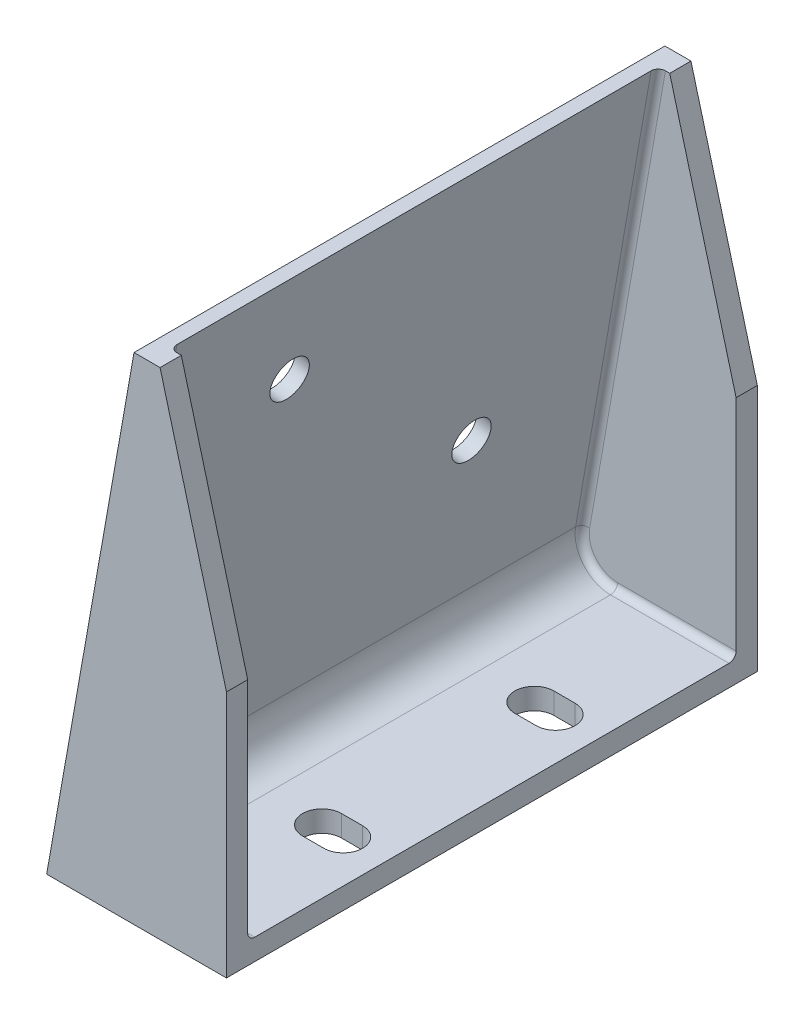
ISO-10303-21;
HEADER;
FILE_DESCRIPTION(('STEP AP214'),'2;1');
FILE_NAME('part.step','',(''),(''),'','','');
FILE_SCHEMA(('AUTOMOTIVE_DESIGN { 1 0 10303 214 1 1 1 1 }'));
ENDSEC;
DATA;
#1=APPLICATION_CONTEXT('core data for automotive mechanical design processes');
#2=APPLICATION_PROTOCOL_DEFINITION('international standard','automotive_design',2000,#1);
#3=PRODUCT_CONTEXT('',#1,'mechanical');
#4=PRODUCT('Part','Part','',(#3));
#5=PRODUCT_RELATED_PRODUCT_CATEGORY('part','',(#4));
#6=PRODUCT_DEFINITION_FORMATION('','',#4);
#7=PRODUCT_DEFINITION_CONTEXT('part definition',#1,'design');
#8=PRODUCT_DEFINITION('design','',#6,#7);
#9=PRODUCT_DEFINITION_SHAPE('','',#8);
#10=(LENGTH_UNIT() NAMED_UNIT(*) SI_UNIT(.MILLI.,.METRE.));
#11=(NAMED_UNIT(*) PLANE_ANGLE_UNIT() SI_UNIT($,.RADIAN.));
#12=(NAMED_UNIT(*) SI_UNIT($,.STERADIAN.) SOLID_ANGLE_UNIT());
#13=UNCERTAINTY_MEASURE_WITH_UNIT(LENGTH_MEASURE(1.E-05),#10,'distance_accuracy_value','');
#14=(GEOMETRIC_REPRESENTATION_CONTEXT(3) GLOBAL_UNCERTAINTY_ASSIGNED_CONTEXT((#13)) GLOBAL_UNIT_ASSIGNED_CONTEXT((#10,
#11,#12)) REPRESENTATION_CONTEXT('',''));
#15=CARTESIAN_POINT('',(0.,0.,0.));
#16=DIRECTION('',(0.,0.,1.));
#17=DIRECTION('',(1.,0.,0.));
#18=AXIS2_PLACEMENT_3D('',#15,#16,#17);
#19=CARTESIAN_POINT('',(-25.4,0.,37.5));
#20=DIRECTION('',(0.,1.,0.));
#21=DIRECTION('',(0.,0.,1.));
#22=AXIS2_PLACEMENT_3D('',#19,#20,#21);
#23=PLANE('',#22);
#24=DIRECTION('',(1.,0.,0.));
#25=VECTOR('',#24,1.);
#26=CARTESIAN_POINT('',(-8.99999999999999,0.,-17.75));
#27=LINE('',#26,#25);
#28=CARTESIAN_POINT('',(-8.99999999999999,0.,-17.75));
#29=VERTEX_POINT('',#28);
#30=CARTESIAN_POINT('',(-6.,0.,-17.75));
#31=VERTEX_POINT('',#30);
#32=EDGE_CURVE('E413',#29,#31,#27,.T.);
#33=ORIENTED_EDGE('',*,*,#32,.F.);
#34=CARTESIAN_POINT('',(-8.99999999999999,0.,-15.));
#35=DIRECTION('',(0.,1.,0.));
#36=DIRECTION('',(0.,0.,1.));
#37=AXIS2_PLACEMENT_3D('',#34,#35,#36);
#38=CIRCLE('',#37,2.75);
#39=CARTESIAN_POINT('',(-8.99999999999999,0.,-12.25));
#40=VERTEX_POINT('',#39);
#41=EDGE_CURVE('E423',#29,#40,#38,.T.);
#42=ORIENTED_EDGE('',*,*,#41,.T.);
#43=DIRECTION('',(1.,0.,0.));
#44=VECTOR('',#43,1.);
#45=CARTESIAN_POINT('',(-8.99999999999999,0.,-12.25));
#46=LINE('',#45,#44);
#47=CARTESIAN_POINT('',(-6.,0.,-12.25));
#48=VERTEX_POINT('',#47);
#49=EDGE_CURVE('E409',#40,#48,#46,.T.);
#50=ORIENTED_EDGE('',*,*,#49,.T.);
#51=CARTESIAN_POINT('',(-6.,0.,-15.));
#52=DIRECTION('',(0.,1.,0.));
#53=DIRECTION('',(0.,0.,1.));
#54=AXIS2_PLACEMENT_3D('',#51,#52,#53);
#55=CIRCLE('',#54,2.75);
#56=EDGE_CURVE('E438',#48,#31,#55,.T.);
#57=ORIENTED_EDGE('',*,*,#56,.T.);
#58=EDGE_LOOP('',(#33,#42,#50,#57));
#59=FACE_BOUND('',#58,.T.);
#60=DIRECTION('',(1.,0.,0.));
#61=VECTOR('',#60,1.);
#62=CARTESIAN_POINT('',(-25.4,0.,-37.5));
#63=LINE('',#62,#61);
#64=CARTESIAN_POINT('',(-25.4,0.,-37.5));
#65=VERTEX_POINT('',#64);
#66=CARTESIAN_POINT('',(0.,0.,-37.5));
#67=VERTEX_POINT('',#66);
#68=EDGE_CURVE('E466',#65,#67,#63,.T.);
#69=ORIENTED_EDGE('',*,*,#68,.T.);
#70=DIRECTION('',(0.,0.,-1.));
#71=VECTOR('',#70,1.);
#72=CARTESIAN_POINT('',(0.,0.,37.5));
#73=LINE('',#72,#71);
#74=CARTESIAN_POINT('',(0.,0.,37.5));
#75=VERTEX_POINT('',#74);
#76=EDGE_CURVE('E504',#75,#67,#73,.T.);
#77=ORIENTED_EDGE('',*,*,#76,.F.);
#78=DIRECTION('',(1.,0.,0.));
#79=VECTOR('',#78,1.);
#80=CARTESIAN_POINT('',(-25.4,0.,37.5));
#81=LINE('',#80,#79);
#82=CARTESIAN_POINT('',(-25.4,0.,37.5));
#83=VERTEX_POINT('',#82);
#84=EDGE_CURVE('E469',#83,#75,#81,.T.);
#85=ORIENTED_EDGE('',*,*,#84,.F.);
#86=DIRECTION('',(0.,0.,-1.));
#87=VECTOR('',#86,1.);
#88=CARTESIAN_POINT('',(-25.4,0.,37.5));
#89=LINE('',#88,#87);
#90=EDGE_CURVE('E484',#83,#65,#89,.T.);
#91=ORIENTED_EDGE('',*,*,#90,.T.);
#92=EDGE_LOOP('',(#69,#77,#85,#91));
#93=FACE_BOUND('',#92,.T.);
#94=DIRECTION('',(1.,0.,0.));
#95=VECTOR('',#94,1.);
#96=CARTESIAN_POINT('',(-8.99999999999999,0.,12.25));
#97=LINE('',#96,#95);
#98=CARTESIAN_POINT('',(-8.99999999999999,0.,12.25));
#99=VERTEX_POINT('',#98);
#100=CARTESIAN_POINT('',(-6.,0.,12.25));
#101=VERTEX_POINT('',#100);
#102=EDGE_CURVE('E358',#99,#101,#97,.T.);
#103=ORIENTED_EDGE('',*,*,#102,.F.);
#104=CARTESIAN_POINT('',(-8.99999999999999,0.,15.));
#105=DIRECTION('',(0.,1.,0.));
#106=DIRECTION('',(0.,0.,1.));
#107=AXIS2_PLACEMENT_3D('',#104,#105,#106);
#108=CIRCLE('',#107,2.75);
#109=CARTESIAN_POINT('',(-8.99999999999999,0.,17.75));
#110=VERTEX_POINT('',#109);
#111=EDGE_CURVE('E371',#99,#110,#108,.T.);
#112=ORIENTED_EDGE('',*,*,#111,.T.);
#113=DIRECTION('',(1.,0.,0.));
#114=VECTOR('',#113,1.);
#115=CARTESIAN_POINT('',(-8.99999999999999,0.,17.75));
#116=LINE('',#115,#114);
#117=CARTESIAN_POINT('',(-6.,0.,17.75));
#118=VERTEX_POINT('',#117);
#119=EDGE_CURVE('E382',#110,#118,#116,.T.);
#120=ORIENTED_EDGE('',*,*,#119,.T.);
#121=CARTESIAN_POINT('',(-6.,0.,15.));
#122=DIRECTION('',(0.,1.,0.));
#123=DIRECTION('',(0.,0.,1.));
#124=AXIS2_PLACEMENT_3D('',#121,#122,#123);
#125=CIRCLE('',#124,2.75);
#126=EDGE_CURVE('E380',#118,#101,#125,.T.);
#127=ORIENTED_EDGE('',*,*,#126,.T.);
#128=EDGE_LOOP('',(#103,#112,#120,#127));
#129=FACE_BOUND('',#128,.T.);
#130=ADVANCED_FACE('F197',(#59,#93,#129),#23,.F.);
#131=CARTESIAN_POINT('',(0.,3.,0.));
#132=DIRECTION('',(0.,-1.,0.));
#133=DIRECTION('',(0.,0.,-1.));
#134=AXIS2_PLACEMENT_3D('',#131,#132,#133);
#135=PLANE('',#134);
#136=DIRECTION('',(0.,0.,-1.));
#137=VECTOR('',#136,1.);
#138=CARTESIAN_POINT('',(-16.7493620884587,3.,0.));
#139=LINE('',#138,#137);
#140=CARTESIAN_POINT('',(-16.7493620884587,3.,-33.5));
#141=VERTEX_POINT('',#140);
#142=CARTESIAN_POINT('',(-16.7493620884587,3.,33.5));
#143=VERTEX_POINT('',#142);
#144=EDGE_CURVE('E539',#141,#143,#139,.F.);
#145=ORIENTED_EDGE('',*,*,#144,.T.);
#146=DIRECTION('',(1.,0.,0.));
#147=VECTOR('',#146,1.);
#148=CARTESIAN_POINT('',(0.,3.,33.5));
#149=LINE('',#148,#147);
#150=CARTESIAN_POINT('',(0.,3.,33.5));
#151=VERTEX_POINT('',#150);
#152=EDGE_CURVE('E547',#143,#151,#149,.T.);
#153=ORIENTED_EDGE('',*,*,#152,.T.);
#154=DIRECTION('',(0.,0.,-1.));
#155=VECTOR('',#154,1.);
#156=CARTESIAN_POINT('',(0.,3.,-34.5));
#157=LINE('',#156,#155);
#158=CARTESIAN_POINT('',(0.,3.,-33.5));
#159=VERTEX_POINT('',#158);
#160=EDGE_CURVE('E449',#151,#159,#157,.T.);
#161=ORIENTED_EDGE('',*,*,#160,.T.);
#162=DIRECTION('',(-1.,0.,0.));
#163=VECTOR('',#162,1.);
#164=CARTESIAN_POINT('',(-16.7493620884587,3.,-33.5));
#165=LINE('',#164,#163);
#166=EDGE_CURVE('E543',#159,#141,#165,.T.);
#167=ORIENTED_EDGE('',*,*,#166,.T.);
#168=EDGE_LOOP('',(#145,#153,#161,#167));
#169=FACE_BOUND('',#168,.T.);
#170=CARTESIAN_POINT('',(-8.99999999999999,3.,-15.));
#171=DIRECTION('',(0.,1.,0.));
#172=DIRECTION('',(0.,0.,1.));
#173=AXIS2_PLACEMENT_3D('',#170,#171,#172);
#174=CIRCLE('',#173,2.74999999999999);
#175=CARTESIAN_POINT('',(-8.99999999999999,3.,-17.75));
#176=VERTEX_POINT('',#175);
#177=CARTESIAN_POINT('',(-8.99999999999999,3.,-12.25));
#178=VERTEX_POINT('',#177);
#179=EDGE_CURVE('E420',#176,#178,#174,.T.);
#180=ORIENTED_EDGE('',*,*,#179,.F.);
#181=DIRECTION('',(1.,0.,0.));
#182=VECTOR('',#181,1.);
#183=CARTESIAN_POINT('',(-8.99999999999999,3.,-17.75));
#184=LINE('',#183,#182);
#185=CARTESIAN_POINT('',(-6.,3.,-17.75));
#186=VERTEX_POINT('',#185);
#187=EDGE_CURVE('E416',#176,#186,#184,.T.);
#188=ORIENTED_EDGE('',*,*,#187,.T.);
#189=CARTESIAN_POINT('',(-6.,3.,-15.));
#190=DIRECTION('',(0.,1.,0.));
#191=DIRECTION('',(0.,0.,1.));
#192=AXIS2_PLACEMENT_3D('',#189,#190,#191);
#193=CIRCLE('',#192,2.74999999999999);
#194=CARTESIAN_POINT('',(-6.,3.,-12.25));
#195=VERTEX_POINT('',#194);
#196=EDGE_CURVE('E434',#195,#186,#193,.T.);
#197=ORIENTED_EDGE('',*,*,#196,.F.);
#198=DIRECTION('',(1.,0.,0.));
#199=VECTOR('',#198,1.);
#200=CARTESIAN_POINT('',(-8.99999999999999,3.,-12.25));
#201=LINE('',#200,#199);
#202=EDGE_CURVE('E406',#178,#195,#201,.T.);
#203=ORIENTED_EDGE('',*,*,#202,.F.);
#204=EDGE_LOOP('',(#180,#188,#197,#203));
#205=FACE_BOUND('',#204,.T.);
#206=DIRECTION('',(1.,0.,0.));
#207=VECTOR('',#206,1.);
#208=CARTESIAN_POINT('',(-8.99999999999999,3.,17.75));
#209=LINE('',#208,#207);
#210=CARTESIAN_POINT('',(-8.99999999999999,3.,17.75));
#211=VERTEX_POINT('',#210);
#212=CARTESIAN_POINT('',(-6.,3.,17.75));
#213=VERTEX_POINT('',#212);
#214=EDGE_CURVE('E387',#211,#213,#209,.T.);
#215=ORIENTED_EDGE('',*,*,#214,.F.);
#216=CARTESIAN_POINT('',(-8.99999999999999,3.,15.));
#217=DIRECTION('',(0.,1.,0.));
#218=DIRECTION('',(0.,0.,1.));
#219=AXIS2_PLACEMENT_3D('',#216,#217,#218);
#220=CIRCLE('',#219,2.74999999999999);
#221=CARTESIAN_POINT('',(-8.99999999999999,3.,12.25));
#222=VERTEX_POINT('',#221);
#223=EDGE_CURVE('E376',#222,#211,#220,.T.);
#224=ORIENTED_EDGE('',*,*,#223,.F.);
#225=DIRECTION('',(1.,0.,0.));
#226=VECTOR('',#225,1.);
#227=CARTESIAN_POINT('',(-8.99999999999999,3.,12.25));
#228=LINE('',#227,#226);
#229=CARTESIAN_POINT('',(-6.,3.,12.25));
#230=VERTEX_POINT('',#229);
#231=EDGE_CURVE('E361',#222,#230,#228,.T.);
#232=ORIENTED_EDGE('',*,*,#231,.T.);
#233=CARTESIAN_POINT('',(-6.,3.,15.));
#234=DIRECTION('',(0.,1.,0.));
#235=DIRECTION('',(0.,0.,1.));
#236=AXIS2_PLACEMENT_3D('',#233,#234,#235);
#237=CIRCLE('',#236,2.74999999999999);
#238=EDGE_CURVE('E366',#213,#230,#237,.T.);
#239=ORIENTED_EDGE('',*,*,#238,.F.);
#240=EDGE_LOOP('',(#215,#224,#232,#239));
#241=FACE_BOUND('',#240,.T.);
#242=ADVANCED_FACE('F661',(#169,#205,#241),#135,.F.);
#243=CARTESIAN_POINT('',(0.,0.,37.5));
#244=DIRECTION('',(-1.,0.,0.));
#245=DIRECTION('',(0.,0.,1.));
#246=AXIS2_PLACEMENT_3D('',#243,#244,#245);
#247=PLANE('',#246);
#248=DIRECTION('',(0.,1.,0.));
#249=VECTOR('',#248,1.);
#250=CARTESIAN_POINT('',(0.,0.,-37.5));
#251=LINE('',#250,#249);
#252=CARTESIAN_POINT('',(0.,34.9999999999995,-37.5));
#253=VERTEX_POINT('',#252);
#254=EDGE_CURVE('E488',#67,#253,#251,.T.);
#255=ORIENTED_EDGE('',*,*,#254,.T.);
#256=DIRECTION('',(0.,0.,1.));
#257=VECTOR('',#256,1.);
#258=CARTESIAN_POINT('',(0.,34.9999999999995,37.5));
#259=LINE('',#258,#257);
#260=CARTESIAN_POINT('',(0.,34.9999999999995,-34.5));
#261=VERTEX_POINT('',#260);
#262=EDGE_CURVE('E522',#253,#261,#259,.T.);
#263=ORIENTED_EDGE('',*,*,#262,.T.);
#264=DIRECTION('',(0.,1.,0.));
#265=VECTOR('',#264,1.);
#266=CARTESIAN_POINT('',(0.,3.,-34.5));
#267=LINE('',#266,#265);
#268=CARTESIAN_POINT('',(0.,4.,-34.5));
#269=VERTEX_POINT('',#268);
#270=EDGE_CURVE('E453',#269,#261,#267,.T.);
#271=ORIENTED_EDGE('',*,*,#270,.F.);
#272=CARTESIAN_POINT('',(0.,4.,-33.5));
#273=DIRECTION('',(-1.,0.,0.));
#274=DIRECTION('',(0.,0.,1.));
#275=AXIS2_PLACEMENT_3D('',#272,#273,#274);
#276=CIRCLE('',#275,1.);
#277=EDGE_CURVE('E583',#269,#159,#276,.T.);
#278=ORIENTED_EDGE('',*,*,#277,.T.);
#279=ORIENTED_EDGE('',*,*,#160,.F.);
#280=CARTESIAN_POINT('',(0.,4.,33.5));
#281=DIRECTION('',(-1.,0.,0.));
#282=DIRECTION('',(0.,0.,1.));
#283=AXIS2_PLACEMENT_3D('',#280,#281,#282);
#284=CIRCLE('',#283,1.);
#285=CARTESIAN_POINT('',(0.,4.,34.5));
#286=VERTEX_POINT('',#285);
#287=EDGE_CURVE('E580',#151,#286,#284,.T.);
#288=ORIENTED_EDGE('',*,*,#287,.T.);
#289=DIRECTION('',(0.,1.,0.));
#290=VECTOR('',#289,1.);
#291=CARTESIAN_POINT('',(0.,3.,34.5));
#292=LINE('',#291,#290);
#293=CARTESIAN_POINT('',(0.,34.9999999999995,34.5));
#294=VERTEX_POINT('',#293);
#295=EDGE_CURVE('E463',#286,#294,#292,.T.);
#296=ORIENTED_EDGE('',*,*,#295,.T.);
#297=DIRECTION('',(0.,0.,1.));
#298=VECTOR('',#297,1.);
#299=CARTESIAN_POINT('',(0.,34.9999999999995,37.5));
#300=LINE('',#299,#298);
#301=CARTESIAN_POINT('',(0.,34.9999999999995,37.5));
#302=VERTEX_POINT('',#301);
#303=EDGE_CURVE('E519',#294,#302,#300,.T.);
#304=ORIENTED_EDGE('',*,*,#303,.T.);
#305=DIRECTION('',(0.,1.,0.));
#306=VECTOR('',#305,1.);
#307=CARTESIAN_POINT('',(0.,0.,37.5));
#308=LINE('',#307,#306);
#309=EDGE_CURVE('E473',#75,#302,#308,.T.);
#310=ORIENTED_EDGE('',*,*,#309,.F.);
#311=ORIENTED_EDGE('',*,*,#76,.T.);
#312=EDGE_LOOP('',(#255,#263,#271,#278,#279,#288,#296,#304,#310,#311));
#313=FACE_BOUND('',#312,.T.);
#314=ADVANCED_FACE('F671',(#313),#247,.F.);
#315=CARTESIAN_POINT('',(0.,70.,37.5));
#316=DIRECTION('',(0.,-1.,0.));
#317=DIRECTION('',(0.,0.,-1.));
#318=AXIS2_PLACEMENT_3D('',#315,#316,#317);
#319=PLANE('',#318);
#320=DIRECTION('',(-1.,0.,0.));
#321=VECTOR('',#320,1.);
#322=CARTESIAN_POINT('',(0.,70.,-34.5));
#323=LINE('',#322,#321);
#324=CARTESIAN_POINT('',(-9.37822173508932,70.,-34.5));
#325=VERTEX_POINT('',#324);
#326=CARTESIAN_POINT('',(-9.98487240510703,70.,-34.5));
#327=VERTEX_POINT('',#326);
#328=EDGE_CURVE('E448',#325,#327,#323,.T.);
#329=ORIENTED_EDGE('',*,*,#328,.F.);
#330=DIRECTION('',(0.,0.,-1.));
#331=VECTOR('',#330,1.);
#332=CARTESIAN_POINT('',(-9.37822173508932,70.,37.5));
#333=LINE('',#332,#331);
#334=CARTESIAN_POINT('',(-9.37822173508932,70.,-37.5));
#335=VERTEX_POINT('',#334);
#336=EDGE_CURVE('E512',#325,#335,#333,.T.);
#337=ORIENTED_EDGE('',*,*,#336,.T.);
#338=DIRECTION('',(-1.,0.,0.));
#339=VECTOR('',#338,1.);
#340=CARTESIAN_POINT('',(0.,70.,-37.5));
#341=LINE('',#340,#339);
#342=CARTESIAN_POINT('',(-13.0571113504072,70.,-37.5));
#343=VERTEX_POINT('',#342);
#344=EDGE_CURVE('E492',#335,#343,#341,.T.);
#345=ORIENTED_EDGE('',*,*,#344,.T.);
#346=DIRECTION('',(0.,0.,-1.));
#347=VECTOR('',#346,1.);
#348=CARTESIAN_POINT('',(-13.0571113504072,70.,37.5));
#349=LINE('',#348,#347);
#350=CARTESIAN_POINT('',(-13.0571113504072,70.,37.5));
#351=VERTEX_POINT('',#350);
#352=EDGE_CURVE('E500',#351,#343,#349,.T.);
#353=ORIENTED_EDGE('',*,*,#352,.F.);
#354=DIRECTION('',(-1.,0.,0.));
#355=VECTOR('',#354,1.);
#356=CARTESIAN_POINT('',(0.,70.,37.5));
#357=LINE('',#356,#355);
#358=CARTESIAN_POINT('',(-9.37822173508932,70.,37.5));
#359=VERTEX_POINT('',#358);
#360=EDGE_CURVE('E478',#359,#351,#357,.T.);
#361=ORIENTED_EDGE('',*,*,#360,.F.);
#362=DIRECTION('',(0.,0.,-1.));
#363=VECTOR('',#362,1.);
#364=CARTESIAN_POINT('',(-9.37822173508932,70.,37.5));
#365=LINE('',#364,#363);
#366=CARTESIAN_POINT('',(-9.37822173508932,70.,34.5));
#367=VERTEX_POINT('',#366);
#368=EDGE_CURVE('E508',#359,#367,#365,.T.);
#369=ORIENTED_EDGE('',*,*,#368,.T.);
#370=DIRECTION('',(1.,0.,0.));
#371=VECTOR('',#370,1.);
#372=CARTESIAN_POINT('',(0.,70.,34.5));
#373=LINE('',#372,#371);
#374=CARTESIAN_POINT('',(-9.98487240510702,70.,34.5));
#375=VERTEX_POINT('',#374);
#376=EDGE_CURVE('E454',#375,#367,#373,.T.);
#377=ORIENTED_EDGE('',*,*,#376,.F.);
#378=CARTESIAN_POINT('',(-9.98487240510703,70.,33.5));
#379=DIRECTION('',(0.,-1.,0.));
#380=DIRECTION('',(-1.,0.,0.));
#381=AXIS2_PLACEMENT_3D('',#378,#379,#380);
#382=ELLIPSE('',#381,1.01512759489297,1.);
#383=CARTESIAN_POINT('',(-11.,70.,33.5));
#384=VERTEX_POINT('',#383);
#385=EDGE_CURVE('E207',#375,#384,#382,.T.);
#386=ORIENTED_EDGE('',*,*,#385,.T.);
#387=DIRECTION('',(0.,0.,1.));
#388=VECTOR('',#387,1.);
#389=CARTESIAN_POINT('',(-11.,70.,-34.5));
#390=LINE('',#389,#388);
#391=CARTESIAN_POINT('',(-11.,70.,-33.5));
#392=VERTEX_POINT('',#391);
#393=EDGE_CURVE('E458',#392,#384,#390,.T.);
#394=ORIENTED_EDGE('',*,*,#393,.F.);
#395=CARTESIAN_POINT('',(-9.98487240510703,70.,-33.5));
#396=DIRECTION('',(0.,-1.,0.));
#397=DIRECTION('',(-1.,0.,0.));
#398=AXIS2_PLACEMENT_3D('',#395,#396,#397);
#399=ELLIPSE('',#398,1.01512759489297,1.);
#400=EDGE_CURVE('E13',#392,#327,#399,.T.);
#401=ORIENTED_EDGE('',*,*,#400,.T.);
#402=EDGE_LOOP('',(#329,#337,#345,#353,#361,#369,#377,#386,#394,#401));
#403=FACE_BOUND('',#402,.T.);
#404=ADVANCED_FACE('F613',(#403),#319,.F.);
#405=CARTESIAN_POINT('',(-13.0571113504072,70.,37.5));
#406=DIRECTION('',(0.984807753012207,-0.173648177666934,0.));
#407=DIRECTION('',(0.173648177666934,0.984807753012207,0.));
#408=AXIS2_PLACEMENT_3D('',#405,#406,#407);
#409=PLANE('',#408);
#410=CARTESIAN_POINT('',(-15.6003986722697,55.5763008494569,15.));
#411=DIRECTION('',(0.984807753012207,-0.173648177666934,0.));
#412=DIRECTION('',(0.173648177666934,0.984807753012207,0.));
#413=AXIS2_PLACEMENT_3D('',#410,#411,#412);
#414=ELLIPSE('',#413,2.75000387400915,2.74999999999999);
#415=CARTESIAN_POINT('',(-15.122865510971,58.2845259853948,15.));
#416=VERTEX_POINT('',#415);
#417=EDGE_CURVE('E946',#416,#416,#414,.T.);
#418=ORIENTED_EDGE('',*,*,#417,.T.);
#419=EDGE_LOOP('',(#418));
#420=FACE_BOUND('',#419,.T.);
#421=CARTESIAN_POINT('',(-19.9416092295306,30.9560723409313,-15.));
#422=DIRECTION('',(0.984807753012207,-0.173648177666934,0.));
#423=DIRECTION('',(0.173648177666934,0.984807753012207,0.));
#424=AXIS2_PLACEMENT_3D('',#421,#422,#423);
#425=ELLIPSE('',#424,2.75000387400915,2.74999999999999);
#426=CARTESIAN_POINT('',(-19.4640760682319,33.6642974768691,-15.));
#427=VERTEX_POINT('',#426);
#428=EDGE_CURVE('E949',#427,#427,#425,.T.);
#429=ORIENTED_EDGE('',*,*,#428,.T.);
#430=EDGE_LOOP('',(#429));
#431=FACE_BOUND('',#430,.T.);
#432=DIRECTION('',(-0.173648177666934,-0.984807753012208,0.));
#433=VECTOR('',#432,1.);
#434=CARTESIAN_POINT('',(-13.0571113504072,70.,-37.5));
#435=LINE('',#434,#433);
#436=EDGE_CURVE('E474',#343,#65,#435,.T.);
#437=ORIENTED_EDGE('',*,*,#436,.T.);
#438=ORIENTED_EDGE('',*,*,#90,.F.);
#439=DIRECTION('',(-0.173648177666934,-0.984807753012208,0.));
#440=VECTOR('',#439,1.);
#441=CARTESIAN_POINT('',(-13.0571113504072,70.,37.5));
#442=LINE('',#441,#440);
#443=EDGE_CURVE('E481',#351,#83,#442,.T.);
#444=ORIENTED_EDGE('',*,*,#443,.F.);
#445=ORIENTED_EDGE('',*,*,#352,.T.);
#446=EDGE_LOOP('',(#437,#438,#444,#445));
#447=FACE_BOUND('',#446,.T.);
#448=ADVANCED_FACE('F630',(#420,#431,#447),#409,.F.);
#449=CARTESIAN_POINT('',(0.,0.,37.5));
#450=DIRECTION('',(0.,0.,1.));
#451=DIRECTION('',(1.,0.,0.));
#452=AXIS2_PLACEMENT_3D('',#449,#450,#451);
#453=PLANE('',#452);
#454=ORIENTED_EDGE('',*,*,#309,.T.);
#455=DIRECTION('',(0.258819045102518,-0.965925826289069,0.));
#456=VECTOR('',#455,1.);
#457=CARTESIAN_POINT('',(8.74999999999979,2.34455543377224,37.5));
#458=LINE('',#457,#456);
#459=EDGE_CURVE('E533',#302,#359,#458,.F.);
#460=ORIENTED_EDGE('',*,*,#459,.T.);
#461=ORIENTED_EDGE('',*,*,#360,.T.);
#462=ORIENTED_EDGE('',*,*,#443,.T.);
#463=ORIENTED_EDGE('',*,*,#84,.T.);
#464=EDGE_LOOP('',(#454,#460,#461,#462,#463));
#465=FACE_BOUND('',#464,.T.);
#466=ADVANCED_FACE('F636',(#465),#453,.T.);
#467=CARTESIAN_POINT('',(0.,0.,-37.5));
#468=DIRECTION('',(0.,0.,1.));
#469=DIRECTION('',(1.,0.,0.));
#470=AXIS2_PLACEMENT_3D('',#467,#468,#469);
#471=PLANE('',#470);
#472=ORIENTED_EDGE('',*,*,#344,.F.);
#473=DIRECTION('',(-0.258819045102518,0.965925826289069,0.));
#474=VECTOR('',#473,1.);
#475=CARTESIAN_POINT('',(-9.37822173508932,70.,-37.5));
#476=LINE('',#475,#474);
#477=EDGE_CURVE('E516',#335,#253,#476,.F.);
#478=ORIENTED_EDGE('',*,*,#477,.T.);
#479=ORIENTED_EDGE('',*,*,#254,.F.);
#480=ORIENTED_EDGE('',*,*,#68,.F.);
#481=ORIENTED_EDGE('',*,*,#436,.F.);
#482=EDGE_LOOP('',(#472,#478,#479,#480,#481));
#483=FACE_BOUND('',#482,.T.);
#484=ADVANCED_FACE('F626',(#483),#471,.F.);
#485=CARTESIAN_POINT('',(0.,3.,34.5));
#486=DIRECTION('',(0.,0.,1.));
#487=DIRECTION('',(1.,0.,0.));
#488=AXIS2_PLACEMENT_3D('',#485,#486,#487);
#489=PLANE('',#488);
#490=ORIENTED_EDGE('',*,*,#295,.F.);
#491=DIRECTION('',(1.,0.,0.));
#492=VECTOR('',#491,1.);
#493=CARTESIAN_POINT('',(-16.7493620884587,4.,34.5));
#494=LINE('',#493,#492);
#495=CARTESIAN_POINT('',(-16.7493620884587,4.00000000000001,34.5));
#496=VERTEX_POINT('',#495);
#497=EDGE_CURVE('E557',#286,#496,#494,.F.);
#498=ORIENTED_EDGE('',*,*,#497,.T.);
#499=CARTESIAN_POINT('',(-16.7493620884587,8.00000000000001,34.5));
#500=DIRECTION('',(0.,0.,1.));
#501=DIRECTION('',(1.,0.,0.));
#502=AXIS2_PLACEMENT_3D('',#499,#500,#501);
#503=CIRCLE('',#502,4.);
#504=CARTESIAN_POINT('',(-20.6897534443077,8.68797962379047,34.5));
#505=VERTEX_POINT('',#504);
#506=EDGE_CURVE('E554',#496,#505,#503,.F.);
#507=ORIENTED_EDGE('',*,*,#506,.T.);
#508=DIRECTION('',(-0.171994905947615,-0.985097838962238,0.));
#509=VECTOR('',#508,1.);
#510=CARTESIAN_POINT('',(-21.0414287174676,6.67376559984821,34.5));
#511=LINE('',#510,#509);
#512=EDGE_CURVE('E551',#505,#375,#511,.F.);
#513=ORIENTED_EDGE('',*,*,#512,.T.);
#514=ORIENTED_EDGE('',*,*,#376,.T.);
#515=DIRECTION('',(-0.258819045102518,0.965925826289069,0.));
#516=VECTOR('',#515,1.);
#517=CARTESIAN_POINT('',(-9.37822173508932,70.,34.5));
#518=LINE('',#517,#516);
#519=EDGE_CURVE('E529',#367,#294,#518,.F.);
#520=ORIENTED_EDGE('',*,*,#519,.T.);
#521=EDGE_LOOP('',(#490,#498,#507,#513,#514,#520));
#522=FACE_BOUND('',#521,.T.);
#523=ADVANCED_FACE('F646',(#522),#489,.F.);
#524=CARTESIAN_POINT('',(0.,3.,-34.5));
#525=DIRECTION('',(0.,0.,-1.));
#526=DIRECTION('',(-1.,0.,0.));
#527=AXIS2_PLACEMENT_3D('',#524,#525,#526);
#528=PLANE('',#527);
#529=CARTESIAN_POINT('',(-16.7493620884587,8.00000000000001,-34.5));
#530=DIRECTION('',(0.,0.,-1.));
#531=DIRECTION('',(-1.,0.,0.));
#532=AXIS2_PLACEMENT_3D('',#529,#530,#531);
#533=CIRCLE('',#532,4.);
#534=CARTESIAN_POINT('',(-20.6897534443077,8.68797962379047,-34.5));
#535=VERTEX_POINT('',#534);
#536=CARTESIAN_POINT('',(-16.7493620884587,4.00000000000001,-34.5));
#537=VERTEX_POINT('',#536);
#538=EDGE_CURVE('E569',#535,#537,#533,.F.);
#539=ORIENTED_EDGE('',*,*,#538,.T.);
#540=DIRECTION('',(-1.,0.,0.));
#541=VECTOR('',#540,1.);
#542=CARTESIAN_POINT('',(0.,4.,-34.5));
#543=LINE('',#542,#541);
#544=EDGE_CURVE('E572',#537,#269,#543,.F.);
#545=ORIENTED_EDGE('',*,*,#544,.T.);
#546=ORIENTED_EDGE('',*,*,#270,.T.);
#547=DIRECTION('',(0.258819045102518,-0.965925826289069,0.));
#548=VECTOR('',#547,1.);
#549=CARTESIAN_POINT('',(-9.37822173508932,70.,-34.5));
#550=LINE('',#549,#548);
#551=EDGE_CURVE('E526',#261,#325,#550,.F.);
#552=ORIENTED_EDGE('',*,*,#551,.T.);
#553=ORIENTED_EDGE('',*,*,#328,.T.);
#554=DIRECTION('',(-0.171994905947615,-0.985097838962238,0.));
#555=VECTOR('',#554,1.);
#556=CARTESIAN_POINT('',(-21.0414287174676,6.67376559984821,-34.5));
#557=LINE('',#556,#555);
#558=EDGE_CURVE('E566',#327,#535,#557,.T.);
#559=ORIENTED_EDGE('',*,*,#558,.T.);
#560=EDGE_LOOP('',(#539,#545,#546,#552,#553,#559));
#561=FACE_BOUND('',#560,.T.);
#562=ADVANCED_FACE('F616',(#561),#528,.F.);
#563=CARTESIAN_POINT('',(-11.,70.,102.513548857829));
#564=DIRECTION('',(0.985097838962238,-0.171994905947614,0.));
#565=DIRECTION('',(0.171994905947615,0.985097838962238,0.));
#566=AXIS2_PLACEMENT_3D('',#563,#564,#565);
#567=PLANE('',#566);
#568=CARTESIAN_POINT('',(-13.5799235892142,55.2235324155664,15.));
#569=DIRECTION('',(0.985097838962238,-0.171994905947614,0.));
#570=DIRECTION('',(0.171994905947615,0.985097838962238,0.));
#571=AXIS2_PLACEMENT_3D('',#568,#569,#570);
#572=CIRCLE('',#571,2.74999999999999);
#573=CARTESIAN_POINT('',(-13.1069375978583,57.9325514727126,15.));
#574=VERTEX_POINT('',#573);
#575=EDGE_CURVE('E595',#574,#574,#572,.T.);
#576=ORIENTED_EDGE('',*,*,#575,.F.);
#577=EDGE_LOOP('',(#576));
#578=FACE_BOUND('',#577,.T.);
#579=CARTESIAN_POINT('',(-17.8797962379046,30.5960864415105,-15.));
#580=DIRECTION('',(0.985097838962238,-0.171994905947614,0.));
#581=DIRECTION('',(0.171994905947615,0.985097838962238,0.));
#582=AXIS2_PLACEMENT_3D('',#579,#580,#581);
#583=CIRCLE('',#582,2.74999999999999);
#584=CARTESIAN_POINT('',(-17.4068102465487,33.3051054986566,-15.));
#585=VERTEX_POINT('',#584);
#586=EDGE_CURVE('E952',#585,#585,#583,.T.);
#587=ORIENTED_EDGE('',*,*,#586,.F.);
#588=EDGE_LOOP('',(#587));
#589=FACE_BOUND('',#588,.T.);
#590=ORIENTED_EDGE('',*,*,#393,.T.);
#591=DIRECTION('',(-0.171994905947615,-0.985097838962238,0.));
#592=VECTOR('',#591,1.);
#593=CARTESIAN_POINT('',(-11.,70.,33.5));
#594=LINE('',#593,#592);
#595=CARTESIAN_POINT('',(-21.6748512832699,8.85997452973809,33.5));
#596=VERTEX_POINT('',#595);
#597=EDGE_CURVE('E577',#384,#596,#594,.T.);
#598=ORIENTED_EDGE('',*,*,#597,.T.);
#599=DIRECTION('',(0.,0.,-1.));
#600=VECTOR('',#599,1.);
#601=CARTESIAN_POINT('',(-21.6748512832699,8.85997452973809,102.513548857829));
#602=LINE('',#601,#600);
#603=CARTESIAN_POINT('',(-21.6748512832699,8.85997452973809,-33.5));
#604=VERTEX_POINT('',#603);
#605=EDGE_CURVE('E536',#596,#604,#602,.T.);
#606=ORIENTED_EDGE('',*,*,#605,.T.);
#607=DIRECTION('',(-0.171994905947615,-0.985097838962238,0.));
#608=VECTOR('',#607,1.);
#609=CARTESIAN_POINT('',(-11.,70.,-33.5));
#610=LINE('',#609,#608);
#611=EDGE_CURVE('E221',#604,#392,#610,.F.);
#612=ORIENTED_EDGE('',*,*,#611,.T.);
#613=EDGE_LOOP('',(#590,#598,#606,#612));
#614=FACE_BOUND('',#613,.T.);
#615=ADVANCED_FACE('F655',(#578,#589,#614),#567,.T.);
#616=CARTESIAN_POINT('',(-6.,3.,-15.));
#617=DIRECTION('',(0.,1.,0.));
#618=DIRECTION('',(0.,0.,1.));
#619=AXIS2_PLACEMENT_3D('',#616,#617,#618);
#620=CYLINDRICAL_SURFACE('',#619,2.74999999999999);
#621=ORIENTED_EDGE('',*,*,#56,.F.);
#622=DIRECTION('',(0.,1.,0.));
#623=VECTOR('',#622,1.);
#624=CARTESIAN_POINT('',(-6.,3.,-12.25));
#625=LINE('',#624,#623);
#626=EDGE_CURVE('E445',#195,#48,#625,.F.);
#627=ORIENTED_EDGE('',*,*,#626,.F.);
#628=ORIENTED_EDGE('',*,*,#196,.T.);
#629=DIRECTION('',(0.,1.,0.));
#630=VECTOR('',#629,1.);
#631=CARTESIAN_POINT('',(-6.,3.,-17.75));
#632=LINE('',#631,#630);
#633=EDGE_CURVE('E442',#31,#186,#632,.T.);
#634=ORIENTED_EDGE('',*,*,#633,.F.);
#635=EDGE_LOOP('',(#621,#627,#628,#634));
#636=FACE_BOUND('',#635,.T.);
#637=ADVANCED_FACE('F834',(#636),#620,.F.);
#638=CARTESIAN_POINT('',(-8.99999999999999,3.,-15.));
#639=DIRECTION('',(0.,1.,0.));
#640=DIRECTION('',(0.,0.,1.));
#641=AXIS2_PLACEMENT_3D('',#638,#639,#640);
#642=CYLINDRICAL_SURFACE('',#641,2.74999999999999);
#643=ORIENTED_EDGE('',*,*,#179,.T.);
#644=DIRECTION('',(0.,1.,0.));
#645=VECTOR('',#644,1.);
#646=CARTESIAN_POINT('',(-8.99999999999999,3.,-12.25));
#647=LINE('',#646,#645);
#648=EDGE_CURVE('E427',#40,#178,#647,.T.);
#649=ORIENTED_EDGE('',*,*,#648,.F.);
#650=ORIENTED_EDGE('',*,*,#41,.F.);
#651=DIRECTION('',(0.,1.,0.));
#652=VECTOR('',#651,1.);
#653=CARTESIAN_POINT('',(-8.99999999999999,3.,-17.75));
#654=LINE('',#653,#652);
#655=EDGE_CURVE('E431',#176,#29,#654,.F.);
#656=ORIENTED_EDGE('',*,*,#655,.F.);
#657=EDGE_LOOP('',(#643,#649,#650,#656));
#658=FACE_BOUND('',#657,.T.);
#659=ADVANCED_FACE('F825',(#658),#642,.F.);
#660=CARTESIAN_POINT('',(-8.99999999999999,3.,-17.75));
#661=DIRECTION('',(0.,0.,-1.));
#662=DIRECTION('',(-1.,0.,0.));
#663=AXIS2_PLACEMENT_3D('',#660,#661,#662);
#664=PLANE('',#663);
#665=ORIENTED_EDGE('',*,*,#633,.T.);
#666=ORIENTED_EDGE('',*,*,#187,.F.);
#667=ORIENTED_EDGE('',*,*,#655,.T.);
#668=ORIENTED_EDGE('',*,*,#32,.T.);
#669=EDGE_LOOP('',(#665,#666,#667,#668));
#670=FACE_BOUND('',#669,.T.);
#671=ADVANCED_FACE('F816',(#670),#664,.F.);
#672=CARTESIAN_POINT('',(-8.99999999999999,3.,-12.25));
#673=DIRECTION('',(0.,0.,1.));
#674=DIRECTION('',(1.,0.,0.));
#675=AXIS2_PLACEMENT_3D('',#672,#673,#674);
#676=PLANE('',#675);
#677=ORIENTED_EDGE('',*,*,#626,.T.);
#678=ORIENTED_EDGE('',*,*,#49,.F.);
#679=ORIENTED_EDGE('',*,*,#648,.T.);
#680=ORIENTED_EDGE('',*,*,#202,.T.);
#681=EDGE_LOOP('',(#677,#678,#679,#680));
#682=FACE_BOUND('',#681,.T.);
#683=ADVANCED_FACE('F807',(#682),#676,.F.);
#684=CARTESIAN_POINT('',(-6.,3.,15.));
#685=DIRECTION('',(0.,1.,0.));
#686=DIRECTION('',(0.,0.,1.));
#687=AXIS2_PLACEMENT_3D('',#684,#685,#686);
#688=CYLINDRICAL_SURFACE('',#687,2.74999999999999);
#689=ORIENTED_EDGE('',*,*,#126,.F.);
#690=DIRECTION('',(0.,1.,0.));
#691=VECTOR('',#690,1.);
#692=CARTESIAN_POINT('',(-6.,3.,17.75));
#693=LINE('',#692,#691);
#694=EDGE_CURVE('E403',#213,#118,#693,.F.);
#695=ORIENTED_EDGE('',*,*,#694,.F.);
#696=ORIENTED_EDGE('',*,*,#238,.T.);
#697=DIRECTION('',(0.,1.,0.));
#698=VECTOR('',#697,1.);
#699=CARTESIAN_POINT('',(-6.,3.,12.25));
#700=LINE('',#699,#698);
#701=EDGE_CURVE('E400',#101,#230,#700,.T.);
#702=ORIENTED_EDGE('',*,*,#701,.F.);
#703=EDGE_LOOP('',(#689,#695,#696,#702));
#704=FACE_BOUND('',#703,.T.);
#705=ADVANCED_FACE('F799',(#704),#688,.F.);
#706=CARTESIAN_POINT('',(-8.99999999999999,3.,15.));
#707=DIRECTION('',(0.,1.,0.));
#708=DIRECTION('',(0.,0.,1.));
#709=AXIS2_PLACEMENT_3D('',#706,#707,#708);
#710=CYLINDRICAL_SURFACE('',#709,2.74999999999999);
#711=ORIENTED_EDGE('',*,*,#223,.T.);
#712=DIRECTION('',(0.,1.,0.));
#713=VECTOR('',#712,1.);
#714=CARTESIAN_POINT('',(-8.99999999999999,3.,17.75));
#715=LINE('',#714,#713);
#716=EDGE_CURVE('E367',#110,#211,#715,.T.);
#717=ORIENTED_EDGE('',*,*,#716,.F.);
#718=ORIENTED_EDGE('',*,*,#111,.F.);
#719=DIRECTION('',(0.,1.,0.));
#720=VECTOR('',#719,1.);
#721=CARTESIAN_POINT('',(-8.99999999999999,3.,12.25));
#722=LINE('',#721,#720);
#723=EDGE_CURVE('E354',#222,#99,#722,.F.);
#724=ORIENTED_EDGE('',*,*,#723,.F.);
#725=EDGE_LOOP('',(#711,#717,#718,#724));
#726=FACE_BOUND('',#725,.T.);
#727=ADVANCED_FACE('F372',(#726),#710,.F.);
#728=CARTESIAN_POINT('',(-8.99999999999999,3.,12.25));
#729=DIRECTION('',(0.,0.,-1.));
#730=DIRECTION('',(-1.,0.,0.));
#731=AXIS2_PLACEMENT_3D('',#728,#729,#730);
#732=PLANE('',#731);
#733=ORIENTED_EDGE('',*,*,#701,.T.);
#734=ORIENTED_EDGE('',*,*,#231,.F.);
#735=ORIENTED_EDGE('',*,*,#723,.T.);
#736=ORIENTED_EDGE('',*,*,#102,.T.);
#737=EDGE_LOOP('',(#733,#734,#735,#736));
#738=FACE_BOUND('',#737,.T.);
#739=ADVANCED_FACE('F356',(#738),#732,.F.);
#740=CARTESIAN_POINT('',(-8.99999999999999,3.,17.75));
#741=DIRECTION('',(0.,0.,1.));
#742=DIRECTION('',(1.,0.,0.));
#743=AXIS2_PLACEMENT_3D('',#740,#741,#742);
#744=PLANE('',#743);
#745=ORIENTED_EDGE('',*,*,#694,.T.);
#746=ORIENTED_EDGE('',*,*,#119,.F.);
#747=ORIENTED_EDGE('',*,*,#716,.T.);
#748=ORIENTED_EDGE('',*,*,#214,.T.);
#749=EDGE_LOOP('',(#745,#746,#747,#748));
#750=FACE_BOUND('',#749,.T.);
#751=ADVANCED_FACE('F775',(#750),#744,.F.);
#752=CARTESIAN_POINT('',(-17.8797962379046,30.5960864415105,-15.));
#753=DIRECTION('',(0.985097838962238,-0.171994905947614,0.));
#754=DIRECTION('',(0.171994905947615,0.985097838962238,0.));
#755=AXIS2_PLACEMENT_3D('',#752,#753,#754);
#756=CYLINDRICAL_SURFACE('',#755,2.74999999999999);
#757=ORIENTED_EDGE('',*,*,#586,.T.);
#758=EDGE_LOOP('',(#757));
#759=FACE_BOUND('',#758,.T.);
#760=ORIENTED_EDGE('',*,*,#428,.F.);
#761=EDGE_LOOP('',(#760));
#762=FACE_BOUND('',#761,.T.);
#763=ADVANCED_FACE('F766',(#759,#762),#756,.F.);
#764=CARTESIAN_POINT('',(-13.5799235892142,55.2235324155664,15.));
#765=DIRECTION('',(0.985097838962238,-0.171994905947614,0.));
#766=DIRECTION('',(0.171994905947615,0.985097838962238,0.));
#767=AXIS2_PLACEMENT_3D('',#764,#765,#766);
#768=CYLINDRICAL_SURFACE('',#767,2.74999999999999);
#769=ORIENTED_EDGE('',*,*,#575,.T.);
#770=EDGE_LOOP('',(#769));
#771=FACE_BOUND('',#770,.T.);
#772=ORIENTED_EDGE('',*,*,#417,.F.);
#773=EDGE_LOOP('',(#772));
#774=FACE_BOUND('',#773,.T.);
#775=ADVANCED_FACE('F698',(#771,#774),#768,.F.);
#776=CARTESIAN_POINT('',(-9.37822173508932,70.,37.5));
#777=DIRECTION('',(-0.965925826289069,-0.258819045102518,0.));
#778=DIRECTION('',(0.,0.,-1.));
#779=AXIS2_PLACEMENT_3D('',#776,#777,#778);
#780=PLANE('',#779);
#781=ORIENTED_EDGE('',*,*,#551,.F.);
#782=ORIENTED_EDGE('',*,*,#262,.F.);
#783=ORIENTED_EDGE('',*,*,#477,.F.);
#784=ORIENTED_EDGE('',*,*,#336,.F.);
#785=EDGE_LOOP('',(#781,#782,#783,#784));
#786=FACE_BOUND('',#785,.T.);
#787=ADVANCED_FACE('F621',(#786),#780,.F.);
#788=CARTESIAN_POINT('',(-9.37822173508932,70.,37.5));
#789=DIRECTION('',(-0.965925826289069,-0.258819045102518,0.));
#790=DIRECTION('',(0.,0.,-1.));
#791=AXIS2_PLACEMENT_3D('',#788,#789,#790);
#792=PLANE('',#791);
#793=ORIENTED_EDGE('',*,*,#459,.F.);
#794=ORIENTED_EDGE('',*,*,#303,.F.);
#795=ORIENTED_EDGE('',*,*,#519,.F.);
#796=ORIENTED_EDGE('',*,*,#368,.F.);
#797=EDGE_LOOP('',(#793,#794,#795,#796));
#798=FACE_BOUND('',#797,.T.);
#799=ADVANCED_FACE('F642',(#798),#792,.F.);
#800=CARTESIAN_POINT('',(-16.7493620884587,8.00000000000001,102.513548857829));
#801=DIRECTION('',(0.,0.,-1.));
#802=DIRECTION('',(-1.,0.,0.));
#803=AXIS2_PLACEMENT_3D('',#800,#801,#802);
#804=CYLINDRICAL_SURFACE('',#803,5.);
#805=ORIENTED_EDGE('',*,*,#605,.F.);
#806=CARTESIAN_POINT('',(-16.7493620884587,8.00000000000001,33.5));
#807=DIRECTION('',(0.,0.,1.));
#808=DIRECTION('',(1.,0.,0.));
#809=AXIS2_PLACEMENT_3D('',#806,#807,#808);
#810=CIRCLE('',#809,5.);
#811=EDGE_CURVE('E563',#596,#143,#810,.T.);
#812=ORIENTED_EDGE('',*,*,#811,.T.);
#813=ORIENTED_EDGE('',*,*,#144,.F.);
#814=CARTESIAN_POINT('',(-16.7493620884587,8.00000000000001,-33.5));
#815=DIRECTION('',(0.,0.,-1.));
#816=DIRECTION('',(-1.,0.,0.));
#817=AXIS2_PLACEMENT_3D('',#814,#815,#816);
#818=CIRCLE('',#817,5.);
#819=EDGE_CURVE('E560',#141,#604,#818,.T.);
#820=ORIENTED_EDGE('',*,*,#819,.T.);
#821=EDGE_LOOP('',(#805,#812,#813,#820));
#822=FACE_BOUND('',#821,.T.);
#823=ADVANCED_FACE('F657',(#822),#804,.F.);
#824=CARTESIAN_POINT('',(-10.0149021610378,69.8280050940524,33.5));
#825=DIRECTION('',(-0.171994905947615,-0.985097838962238,0.));
#826=DIRECTION('',(0.985097838962238,-0.171994905947614,0.));
#827=AXIS2_PLACEMENT_3D('',#824,#825,#826);
#828=CYLINDRICAL_SURFACE('',#827,1.);
#829=ORIENTED_EDGE('',*,*,#385,.F.);
#830=ORIENTED_EDGE('',*,*,#512,.F.);
#831=CARTESIAN_POINT('',(-20.6897534443077,8.68797962379047,33.5));
#832=DIRECTION('',(0.171994905947614,0.985097838962238,0.));
#833=DIRECTION('',(-0.985097838962238,0.171994905947614,0.));
#834=AXIS2_PLACEMENT_3D('',#831,#832,#833);
#835=CIRCLE('',#834,1.);
#836=EDGE_CURVE('E592',#596,#505,#835,.T.);
#837=ORIENTED_EDGE('',*,*,#836,.F.);
#838=ORIENTED_EDGE('',*,*,#597,.F.);
#839=EDGE_LOOP('',(#829,#830,#837,#838));
#840=FACE_BOUND('',#839,.T.);
#841=ADVANCED_FACE('F651',(#840),#828,.F.);
#842=CARTESIAN_POINT('',(-16.7493620884587,8.00000000000001,33.5));
#843=DIRECTION('',(0.,0.,1.));
#844=DIRECTION('',(1.,0.,0.));
#845=AXIS2_PLACEMENT_3D('',#842,#843,#844);
#846=TOROIDAL_SURFACE('',#845,4.,1.);
#847=ORIENTED_EDGE('',*,*,#836,.T.);
#848=ORIENTED_EDGE('',*,*,#506,.F.);
#849=CARTESIAN_POINT('',(-16.7493620884587,4.00000000000001,33.5));
#850=DIRECTION('',(-1.,0.,0.));
#851=DIRECTION('',(0.,0.,1.));
#852=AXIS2_PLACEMENT_3D('',#849,#850,#851);
#853=CIRCLE('',#852,1.);
#854=EDGE_CURVE('E588',#143,#496,#853,.T.);
#855=ORIENTED_EDGE('',*,*,#854,.F.);
#856=ORIENTED_EDGE('',*,*,#811,.F.);
#857=EDGE_LOOP('',(#847,#848,#855,#856));
#858=FACE_BOUND('',#857,.T.);
#859=ADVANCED_FACE('F667',(#858),#846,.F.);
#860=CARTESIAN_POINT('',(0.,4.,33.5));
#861=DIRECTION('',(-1.,0.,0.));
#862=DIRECTION('',(0.,0.,1.));
#863=AXIS2_PLACEMENT_3D('',#860,#861,#862);
#864=CYLINDRICAL_SURFACE('',#863,1.);
#865=ORIENTED_EDGE('',*,*,#854,.T.);
#866=ORIENTED_EDGE('',*,*,#497,.F.);
#867=ORIENTED_EDGE('',*,*,#287,.F.);
#868=ORIENTED_EDGE('',*,*,#152,.F.);
#869=EDGE_LOOP('',(#865,#866,#867,#868));
#870=FACE_BOUND('',#869,.T.);
#871=ADVANCED_FACE('F669',(#870),#864,.F.);
#872=CARTESIAN_POINT('',(-21.0414287174676,6.67376559984821,-33.5));
#873=DIRECTION('',(-0.171994905947615,-0.985097838962238,0.));
#874=DIRECTION('',(0.985097838962238,-0.171994905947614,0.));
#875=AXIS2_PLACEMENT_3D('',#872,#873,#874);
#876=CYLINDRICAL_SURFACE('',#875,1.);
#877=ORIENTED_EDGE('',*,*,#400,.F.);
#878=ORIENTED_EDGE('',*,*,#611,.F.);
#879=CARTESIAN_POINT('',(-20.6897534443077,8.68797962379047,-33.5));
#880=DIRECTION('',(0.171994905947617,0.985097838962237,0.));
#881=DIRECTION('',(-0.985097838962237,0.171994905947617,0.));
#882=AXIS2_PLACEMENT_3D('',#879,#880,#881);
#883=CIRCLE('',#882,1.);
#884=EDGE_CURVE('E201',#535,#604,#883,.T.);
#885=ORIENTED_EDGE('',*,*,#884,.F.);
#886=ORIENTED_EDGE('',*,*,#558,.F.);
#887=EDGE_LOOP('',(#877,#878,#885,#886));
#888=FACE_BOUND('',#887,.T.);
#889=ADVANCED_FACE('F199',(#888),#876,.F.);
#890=CARTESIAN_POINT('',(-16.7493620884587,8.00000000000001,-33.5));
#891=DIRECTION('',(0.,0.,-1.));
#892=DIRECTION('',(-1.,0.,0.));
#893=AXIS2_PLACEMENT_3D('',#890,#891,#892);
#894=TOROIDAL_SURFACE('',#893,4.,1.);
#895=ORIENTED_EDGE('',*,*,#884,.T.);
#896=ORIENTED_EDGE('',*,*,#819,.F.);
#897=CARTESIAN_POINT('',(-16.7493620884587,4.00000000000001,-33.5));
#898=DIRECTION('',(-1.,0.,0.));
#899=DIRECTION('',(0.,0.,1.));
#900=AXIS2_PLACEMENT_3D('',#897,#898,#899);
#901=CIRCLE('',#900,1.);
#902=EDGE_CURVE('E596',#537,#141,#901,.T.);
#903=ORIENTED_EDGE('',*,*,#902,.F.);
#904=ORIENTED_EDGE('',*,*,#538,.F.);
#905=EDGE_LOOP('',(#895,#896,#903,#904));
#906=FACE_BOUND('',#905,.T.);
#907=ADVANCED_FACE('F608',(#906),#894,.F.);
#908=CARTESIAN_POINT('',(0.,4.,-33.5));
#909=DIRECTION('',(1.,0.,0.));
#910=DIRECTION('',(0.,0.,-1.));
#911=AXIS2_PLACEMENT_3D('',#908,#909,#910);
#912=CYLINDRICAL_SURFACE('',#911,1.);
#913=ORIENTED_EDGE('',*,*,#277,.F.);
#914=ORIENTED_EDGE('',*,*,#544,.F.);
#915=ORIENTED_EDGE('',*,*,#902,.T.);
#916=ORIENTED_EDGE('',*,*,#166,.F.);
#917=EDGE_LOOP('',(#913,#914,#915,#916));
#918=FACE_BOUND('',#917,.T.);
#919=ADVANCED_FACE('F673',(#918),#912,.F.);
#920=CLOSED_SHELL('',(#130,#242,#314,#404,#448,#466,#484,#523,#562,#615,#637,#659,#671,#683,
#705,#727,#739,#751,#763,#775,#787,#799,#823,#841,#859,#871,#889,#907,#919));
#921=MANIFOLD_SOLID_BREP('B2',#920);
#922=ADVANCED_BREP_SHAPE_REPRESENTATION('',(#18,#921),#14);
#923=SHAPE_DEFINITION_REPRESENTATION(#9,#922);
ENDSEC;
END-ISO-10303-21;
